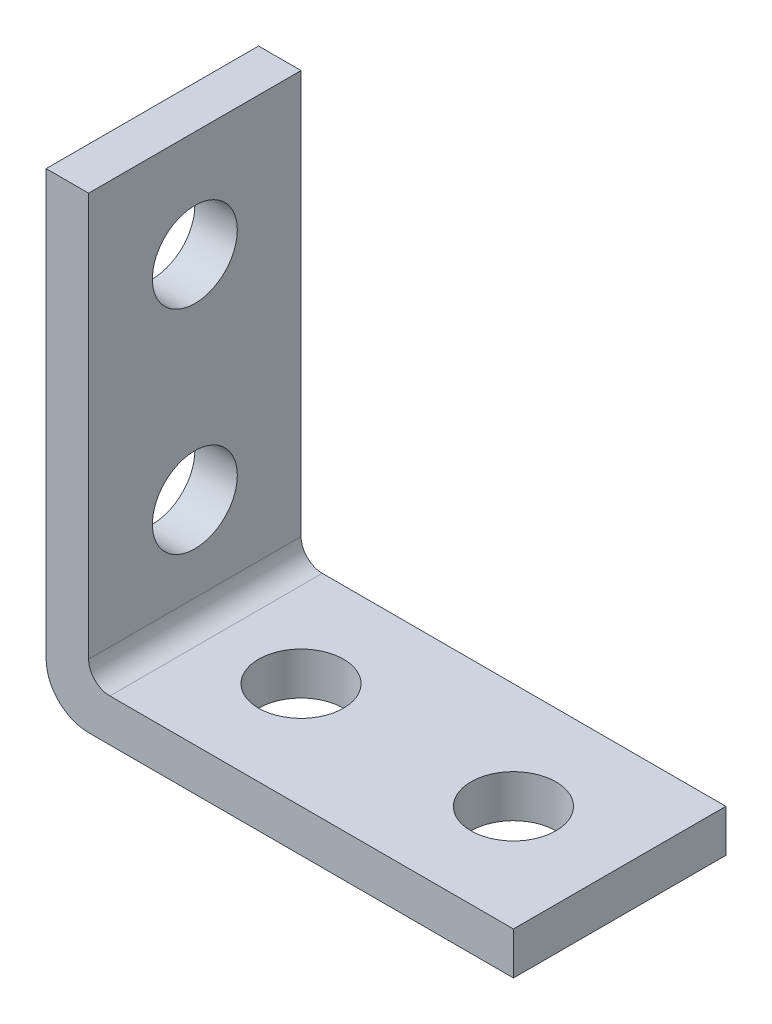
ISO-10303-21;
HEADER;
FILE_DESCRIPTION(('STEP AP214'),'2;1');
FILE_NAME('part.step','',(''),(''),'','','');
FILE_SCHEMA(('AUTOMOTIVE_DESIGN { 1 0 10303 214 1 1 1 1 }'));
ENDSEC;
DATA;
#1=APPLICATION_CONTEXT('core data for automotive mechanical design processes');
#2=APPLICATION_PROTOCOL_DEFINITION('international standard','automotive_design',2000,#1);
#3=PRODUCT_CONTEXT('',#1,'mechanical');
#4=PRODUCT('Part','Part','',(#3));
#5=PRODUCT_RELATED_PRODUCT_CATEGORY('part','',(#4));
#6=PRODUCT_DEFINITION_FORMATION('','',#4);
#7=PRODUCT_DEFINITION_CONTEXT('part definition',#1,'design');
#8=PRODUCT_DEFINITION('design','',#6,#7);
#9=PRODUCT_DEFINITION_SHAPE('','',#8);
#10=(LENGTH_UNIT() NAMED_UNIT(*) SI_UNIT(.MILLI.,.METRE.));
#11=(NAMED_UNIT(*) PLANE_ANGLE_UNIT() SI_UNIT($,.RADIAN.));
#12=(NAMED_UNIT(*) SI_UNIT($,.STERADIAN.) SOLID_ANGLE_UNIT());
#13=UNCERTAINTY_MEASURE_WITH_UNIT(LENGTH_MEASURE(1.E-05),#10,'distance_accuracy_value','');
#14=(GEOMETRIC_REPRESENTATION_CONTEXT(3) GLOBAL_UNCERTAINTY_ASSIGNED_CONTEXT((#13)) GLOBAL_UNIT_ASSIGNED_CONTEXT((#10,
#11,#12)) REPRESENTATION_CONTEXT('',''));
#15=CARTESIAN_POINT('',(0.,0.,0.));
#16=DIRECTION('',(0.,0.,1.));
#17=DIRECTION('',(1.,0.,0.));
#18=AXIS2_PLACEMENT_3D('',#15,#16,#17);
#19=CARTESIAN_POINT('',(10.,2.,5.));
#20=DIRECTION('',(0.,0.,-1.));
#21=DIRECTION('',(-1.,0.,0.));
#22=AXIS2_PLACEMENT_3D('',#19,#20,#21);
#23=PLANE('',#22);
#24=DIRECTION('',(0.,1.,0.));
#25=VECTOR('',#24,1.);
#26=CARTESIAN_POINT('',(-12.,22.,5.));
#27=LINE('',#26,#25);
#28=CARTESIAN_POINT('',(-12.,2.,5.));
#29=VERTEX_POINT('',#28);
#30=CARTESIAN_POINT('',(-12.,22.,5.));
#31=VERTEX_POINT('',#30);
#32=EDGE_CURVE('E101',#29,#31,#27,.T.);
#33=ORIENTED_EDGE('',*,*,#32,.F.);
#34=CARTESIAN_POINT('',(-10.,2.,5.));
#35=DIRECTION('',(0.,0.,-1.));
#36=DIRECTION('',(-1.,0.,0.));
#37=AXIS2_PLACEMENT_3D('',#34,#35,#36);
#38=CIRCLE('',#37,2.);
#39=CARTESIAN_POINT('',(-10.,0.,5.));
#40=VERTEX_POINT('',#39);
#41=EDGE_CURVE('E148',#29,#40,#38,.F.);
#42=ORIENTED_EDGE('',*,*,#41,.T.);
#43=DIRECTION('',(1.,0.,0.));
#44=VECTOR('',#43,1.);
#45=CARTESIAN_POINT('',(10.,0.,5.));
#46=LINE('',#45,#44);
#47=CARTESIAN_POINT('',(10.,0.,5.));
#48=VERTEX_POINT('',#47);
#49=EDGE_CURVE('E123',#40,#48,#46,.T.);
#50=ORIENTED_EDGE('',*,*,#49,.T.);
#51=DIRECTION('',(0.,-1.,0.));
#52=VECTOR('',#51,1.);
#53=CARTESIAN_POINT('',(10.,2.,5.));
#54=LINE('',#53,#52);
#55=CARTESIAN_POINT('',(10.,2.,5.));
#56=VERTEX_POINT('',#55);
#57=EDGE_CURVE('E144',#56,#48,#54,.T.);
#58=ORIENTED_EDGE('',*,*,#57,.F.);
#59=DIRECTION('',(1.,0.,0.));
#60=VECTOR('',#59,1.);
#61=CARTESIAN_POINT('',(10.,2.,5.));
#62=LINE('',#61,#60);
#63=CARTESIAN_POINT('',(-9.,2.,5.));
#64=VERTEX_POINT('',#63);
#65=EDGE_CURVE('E130',#64,#56,#62,.T.);
#66=ORIENTED_EDGE('',*,*,#65,.F.);
#67=CARTESIAN_POINT('',(-9.,3.,5.));
#68=DIRECTION('',(0.,0.,-1.));
#69=DIRECTION('',(-1.,0.,0.));
#70=AXIS2_PLACEMENT_3D('',#67,#68,#69);
#71=CIRCLE('',#70,1.);
#72=CARTESIAN_POINT('',(-10.,3.,5.));
#73=VERTEX_POINT('',#72);
#74=EDGE_CURVE('E45',#64,#73,#71,.T.);
#75=ORIENTED_EDGE('',*,*,#74,.T.);
#76=DIRECTION('',(0.,1.,0.));
#77=VECTOR('',#76,1.);
#78=CARTESIAN_POINT('',(-10.,22.,5.));
#79=LINE('',#78,#77);
#80=CARTESIAN_POINT('',(-10.,22.,5.));
#81=VERTEX_POINT('',#80);
#82=EDGE_CURVE('E121',#73,#81,#79,.T.);
#83=ORIENTED_EDGE('',*,*,#82,.T.);
#84=DIRECTION('',(1.,0.,0.));
#85=VECTOR('',#84,1.);
#86=CARTESIAN_POINT('',(-12.,22.,5.));
#87=LINE('',#86,#85);
#88=EDGE_CURVE('E115',#31,#81,#87,.T.);
#89=ORIENTED_EDGE('',*,*,#88,.F.);
#90=EDGE_LOOP('',(#33,#42,#50,#58,#66,#75,#83,#89));
#91=FACE_BOUND('',#90,.T.);
#92=ADVANCED_FACE('F37',(#91),#23,.F.);
#93=CARTESIAN_POINT('',(10.,2.,5.));
#94=DIRECTION('',(-1.,0.,0.));
#95=DIRECTION('',(0.,0.,1.));
#96=AXIS2_PLACEMENT_3D('',#93,#94,#95);
#97=PLANE('',#96);
#98=DIRECTION('',(0.,0.,-1.));
#99=VECTOR('',#98,1.);
#100=CARTESIAN_POINT('',(10.,0.,5.));
#101=LINE('',#100,#99);
#102=CARTESIAN_POINT('',(10.,0.,-5.));
#103=VERTEX_POINT('',#102);
#104=EDGE_CURVE('E125',#48,#103,#101,.T.);
#105=ORIENTED_EDGE('',*,*,#104,.T.);
#106=DIRECTION('',(0.,-1.,0.));
#107=VECTOR('',#106,1.);
#108=CARTESIAN_POINT('',(10.,2.,-5.));
#109=LINE('',#108,#107);
#110=CARTESIAN_POINT('',(10.,2.,-5.));
#111=VERTEX_POINT('',#110);
#112=EDGE_CURVE('E137',#111,#103,#109,.T.);
#113=ORIENTED_EDGE('',*,*,#112,.F.);
#114=DIRECTION('',(0.,0.,-1.));
#115=VECTOR('',#114,1.);
#116=CARTESIAN_POINT('',(10.,2.,5.));
#117=LINE('',#116,#115);
#118=EDGE_CURVE('E132',#56,#111,#117,.T.);
#119=ORIENTED_EDGE('',*,*,#118,.F.);
#120=ORIENTED_EDGE('',*,*,#57,.T.);
#121=EDGE_LOOP('',(#105,#113,#119,#120));
#122=FACE_BOUND('',#121,.T.);
#123=ADVANCED_FACE('F169',(#122),#97,.F.);
#124=CARTESIAN_POINT('',(10.,2.,-5.));
#125=DIRECTION('',(0.,0.,1.));
#126=DIRECTION('',(1.,0.,0.));
#127=AXIS2_PLACEMENT_3D('',#124,#125,#126);
#128=PLANE('',#127);
#129=DIRECTION('',(-1.,0.,0.));
#130=VECTOR('',#129,1.);
#131=CARTESIAN_POINT('',(10.,0.,-5.));
#132=LINE('',#131,#130);
#133=CARTESIAN_POINT('',(-10.,0.,-5.));
#134=VERTEX_POINT('',#133);
#135=EDGE_CURVE('E133',#103,#134,#132,.T.);
#136=ORIENTED_EDGE('',*,*,#135,.T.);
#137=CARTESIAN_POINT('',(-10.,2.,-5.));
#138=DIRECTION('',(0.,0.,1.));
#139=DIRECTION('',(1.,0.,0.));
#140=AXIS2_PLACEMENT_3D('',#137,#138,#139);
#141=CIRCLE('',#140,2.);
#142=CARTESIAN_POINT('',(-12.,2.,-5.));
#143=VERTEX_POINT('',#142);
#144=EDGE_CURVE('E152',#134,#143,#141,.F.);
#145=ORIENTED_EDGE('',*,*,#144,.T.);
#146=DIRECTION('',(0.,-1.,0.));
#147=VECTOR('',#146,1.);
#148=CARTESIAN_POINT('',(-12.,22.,-5.));
#149=LINE('',#148,#147);
#150=CARTESIAN_POINT('',(-12.,22.,-5.));
#151=VERTEX_POINT('',#150);
#152=EDGE_CURVE('E119',#151,#143,#149,.T.);
#153=ORIENTED_EDGE('',*,*,#152,.F.);
#154=DIRECTION('',(1.,0.,0.));
#155=VECTOR('',#154,1.);
#156=CARTESIAN_POINT('',(-12.,22.,-5.));
#157=LINE('',#156,#155);
#158=CARTESIAN_POINT('',(-10.,22.,-5.));
#159=VERTEX_POINT('',#158);
#160=EDGE_CURVE('E117',#151,#159,#157,.T.);
#161=ORIENTED_EDGE('',*,*,#160,.T.);
#162=DIRECTION('',(0.,-1.,0.));
#163=VECTOR('',#162,1.);
#164=CARTESIAN_POINT('',(-10.,22.,-5.));
#165=LINE('',#164,#163);
#166=CARTESIAN_POINT('',(-10.,3.,-5.));
#167=VERTEX_POINT('',#166);
#168=EDGE_CURVE('E110',#159,#167,#165,.T.);
#169=ORIENTED_EDGE('',*,*,#168,.T.);
#170=CARTESIAN_POINT('',(-9.,3.,-5.));
#171=DIRECTION('',(0.,0.,1.));
#172=DIRECTION('',(1.,0.,0.));
#173=AXIS2_PLACEMENT_3D('',#170,#171,#172);
#174=CIRCLE('',#173,1.);
#175=CARTESIAN_POINT('',(-9.,2.,-5.));
#176=VERTEX_POINT('',#175);
#177=EDGE_CURVE('E11',#167,#176,#174,.T.);
#178=ORIENTED_EDGE('',*,*,#177,.T.);
#179=DIRECTION('',(-1.,0.,0.));
#180=VECTOR('',#179,1.);
#181=CARTESIAN_POINT('',(10.,2.,-5.));
#182=LINE('',#181,#180);
#183=EDGE_CURVE('E135',#111,#176,#182,.T.);
#184=ORIENTED_EDGE('',*,*,#183,.F.);
#185=ORIENTED_EDGE('',*,*,#112,.T.);
#186=EDGE_LOOP('',(#136,#145,#153,#161,#169,#178,#184,#185));
#187=FACE_BOUND('',#186,.T.);
#188=ADVANCED_FACE('F172',(#187),#128,.F.);
#189=CARTESIAN_POINT('',(0.,2.,0.));
#190=DIRECTION('',(0.,1.,0.));
#191=DIRECTION('',(0.,0.,1.));
#192=AXIS2_PLACEMENT_3D('',#189,#190,#191);
#193=PLANE('',#192);
#194=CARTESIAN_POINT('',(-5.,2.,0.));
#195=DIRECTION('',(0.,1.,0.));
#196=DIRECTION('',(0.,0.,1.));
#197=AXIS2_PLACEMENT_3D('',#194,#195,#196);
#198=CIRCLE('',#197,2.);
#199=CARTESIAN_POINT('',(-5.,2.,2.));
#200=VERTEX_POINT('',#199);
#201=EDGE_CURVE('E241',#200,#200,#198,.T.);
#202=ORIENTED_EDGE('',*,*,#201,.F.);
#203=EDGE_LOOP('',(#202));
#204=FACE_BOUND('',#203,.T.);
#205=CARTESIAN_POINT('',(5.,2.,0.));
#206=DIRECTION('',(0.,1.,0.));
#207=DIRECTION('',(0.,0.,1.));
#208=AXIS2_PLACEMENT_3D('',#205,#206,#207);
#209=CIRCLE('',#208,2.);
#210=CARTESIAN_POINT('',(5.,2.,2.));
#211=VERTEX_POINT('',#210);
#212=EDGE_CURVE('E244',#211,#211,#209,.T.);
#213=ORIENTED_EDGE('',*,*,#212,.F.);
#214=EDGE_LOOP('',(#213));
#215=FACE_BOUND('',#214,.T.);
#216=ORIENTED_EDGE('',*,*,#183,.T.);
#217=DIRECTION('',(0.,0.,1.));
#218=VECTOR('',#217,1.);
#219=CARTESIAN_POINT('',(-9.,2.,0.));
#220=LINE('',#219,#218);
#221=EDGE_CURVE('E154',#176,#64,#220,.T.);
#222=ORIENTED_EDGE('',*,*,#221,.T.);
#223=ORIENTED_EDGE('',*,*,#65,.T.);
#224=ORIENTED_EDGE('',*,*,#118,.T.);
#225=EDGE_LOOP('',(#216,#222,#223,#224));
#226=FACE_BOUND('',#225,.T.);
#227=ADVANCED_FACE('F159',(#204,#215,#226),#193,.T.);
#228=CARTESIAN_POINT('',(0.,0.,0.));
#229=DIRECTION('',(0.,1.,0.));
#230=DIRECTION('',(0.,0.,1.));
#231=AXIS2_PLACEMENT_3D('',#228,#229,#230);
#232=PLANE('',#231);
#233=CARTESIAN_POINT('',(-5.,0.,0.));
#234=DIRECTION('',(0.,1.,0.));
#235=DIRECTION('',(0.,0.,1.));
#236=AXIS2_PLACEMENT_3D('',#233,#234,#235);
#237=CIRCLE('',#236,2.);
#238=CARTESIAN_POINT('',(-5.,0.,2.));
#239=VERTEX_POINT('',#238);
#240=EDGE_CURVE('E238',#239,#239,#237,.T.);
#241=ORIENTED_EDGE('',*,*,#240,.T.);
#242=EDGE_LOOP('',(#241));
#243=FACE_BOUND('',#242,.T.);
#244=CARTESIAN_POINT('',(5.,0.,0.));
#245=DIRECTION('',(0.,1.,0.));
#246=DIRECTION('',(0.,0.,1.));
#247=AXIS2_PLACEMENT_3D('',#244,#245,#246);
#248=CIRCLE('',#247,2.);
#249=CARTESIAN_POINT('',(5.,0.,2.));
#250=VERTEX_POINT('',#249);
#251=EDGE_CURVE('E230',#250,#250,#248,.T.);
#252=ORIENTED_EDGE('',*,*,#251,.T.);
#253=EDGE_LOOP('',(#252));
#254=FACE_BOUND('',#253,.T.);
#255=ORIENTED_EDGE('',*,*,#49,.F.);
#256=DIRECTION('',(0.,0.,1.));
#257=VECTOR('',#256,1.);
#258=CARTESIAN_POINT('',(-10.,0.,-5.));
#259=LINE('',#258,#257);
#260=EDGE_CURVE('E150',#40,#134,#259,.F.);
#261=ORIENTED_EDGE('',*,*,#260,.T.);
#262=ORIENTED_EDGE('',*,*,#135,.F.);
#263=ORIENTED_EDGE('',*,*,#104,.F.);
#264=EDGE_LOOP('',(#255,#261,#262,#263));
#265=FACE_BOUND('',#264,.T.);
#266=ADVANCED_FACE('F194',(#243,#254,#265),#232,.F.);
#267=CARTESIAN_POINT('',(-12.,22.,-5.));
#268=DIRECTION('',(0.,-1.,0.));
#269=DIRECTION('',(0.,0.,-1.));
#270=AXIS2_PLACEMENT_3D('',#267,#268,#269);
#271=PLANE('',#270);
#272=DIRECTION('',(0.,0.,-1.));
#273=VECTOR('',#272,1.);
#274=CARTESIAN_POINT('',(-10.,22.,-5.));
#275=LINE('',#274,#273);
#276=EDGE_CURVE('E251',#81,#159,#275,.T.);
#277=ORIENTED_EDGE('',*,*,#276,.T.);
#278=ORIENTED_EDGE('',*,*,#160,.F.);
#279=DIRECTION('',(0.,0.,-1.));
#280=VECTOR('',#279,1.);
#281=CARTESIAN_POINT('',(-12.,22.,-5.));
#282=LINE('',#281,#280);
#283=EDGE_CURVE('E105',#31,#151,#282,.T.);
#284=ORIENTED_EDGE('',*,*,#283,.F.);
#285=ORIENTED_EDGE('',*,*,#88,.T.);
#286=EDGE_LOOP('',(#277,#278,#284,#285));
#287=FACE_BOUND('',#286,.T.);
#288=ADVANCED_FACE('F114',(#287),#271,.F.);
#289=CARTESIAN_POINT('',(-12.,0.,0.));
#290=DIRECTION('',(-1.,0.,0.));
#291=DIRECTION('',(0.,0.,1.));
#292=AXIS2_PLACEMENT_3D('',#289,#290,#291);
#293=PLANE('',#292);
#294=CARTESIAN_POINT('',(-12.,7.,0.));
#295=DIRECTION('',(1.,0.,0.));
#296=DIRECTION('',(0.,0.,-1.));
#297=AXIS2_PLACEMENT_3D('',#294,#295,#296);
#298=CIRCLE('',#297,2.);
#299=CARTESIAN_POINT('',(-12.,7.,-2.));
#300=VERTEX_POINT('',#299);
#301=EDGE_CURVE('E224',#300,#300,#298,.T.);
#302=ORIENTED_EDGE('',*,*,#301,.T.);
#303=EDGE_LOOP('',(#302));
#304=FACE_BOUND('',#303,.T.);
#305=CARTESIAN_POINT('',(-12.,17.,0.));
#306=DIRECTION('',(1.,0.,0.));
#307=DIRECTION('',(0.,0.,-1.));
#308=AXIS2_PLACEMENT_3D('',#305,#306,#307);
#309=CIRCLE('',#308,2.);
#310=CARTESIAN_POINT('',(-12.,17.,-2.));
#311=VERTEX_POINT('',#310);
#312=EDGE_CURVE('E233',#311,#311,#309,.T.);
#313=ORIENTED_EDGE('',*,*,#312,.T.);
#314=EDGE_LOOP('',(#313));
#315=FACE_BOUND('',#314,.T.);
#316=ORIENTED_EDGE('',*,*,#152,.T.);
#317=DIRECTION('',(0.,0.,1.));
#318=VECTOR('',#317,1.);
#319=CARTESIAN_POINT('',(-12.,2.,5.));
#320=LINE('',#319,#318);
#321=EDGE_CURVE('E108',#143,#29,#320,.T.);
#322=ORIENTED_EDGE('',*,*,#321,.T.);
#323=ORIENTED_EDGE('',*,*,#32,.T.);
#324=ORIENTED_EDGE('',*,*,#283,.T.);
#325=EDGE_LOOP('',(#316,#322,#323,#324));
#326=FACE_BOUND('',#325,.T.);
#327=ADVANCED_FACE('F104',(#304,#315,#326),#293,.T.);
#328=CARTESIAN_POINT('',(-10.,0.,0.));
#329=DIRECTION('',(-1.,0.,0.));
#330=DIRECTION('',(0.,0.,1.));
#331=AXIS2_PLACEMENT_3D('',#328,#329,#330);
#332=PLANE('',#331);
#333=CARTESIAN_POINT('',(-10.,7.,0.));
#334=DIRECTION('',(1.,0.,0.));
#335=DIRECTION('',(0.,0.,-1.));
#336=AXIS2_PLACEMENT_3D('',#333,#334,#335);
#337=CIRCLE('',#336,2.);
#338=CARTESIAN_POINT('',(-10.,7.,-2.));
#339=VERTEX_POINT('',#338);
#340=EDGE_CURVE('E227',#339,#339,#337,.T.);
#341=ORIENTED_EDGE('',*,*,#340,.F.);
#342=EDGE_LOOP('',(#341));
#343=FACE_BOUND('',#342,.T.);
#344=CARTESIAN_POINT('',(-10.,17.,0.));
#345=DIRECTION('',(1.,0.,0.));
#346=DIRECTION('',(0.,0.,-1.));
#347=AXIS2_PLACEMENT_3D('',#344,#345,#346);
#348=CIRCLE('',#347,2.);
#349=CARTESIAN_POINT('',(-10.,17.,-2.));
#350=VERTEX_POINT('',#349);
#351=EDGE_CURVE('E228',#350,#350,#348,.T.);
#352=ORIENTED_EDGE('',*,*,#351,.F.);
#353=EDGE_LOOP('',(#352));
#354=FACE_BOUND('',#353,.T.);
#355=ORIENTED_EDGE('',*,*,#82,.F.);
#356=DIRECTION('',(0.,0.,1.));
#357=VECTOR('',#356,1.);
#358=CARTESIAN_POINT('',(-10.,3.,0.));
#359=LINE('',#358,#357);
#360=EDGE_CURVE('E58',#73,#167,#359,.F.);
#361=ORIENTED_EDGE('',*,*,#360,.T.);
#362=ORIENTED_EDGE('',*,*,#168,.F.);
#363=ORIENTED_EDGE('',*,*,#276,.F.);
#364=EDGE_LOOP('',(#355,#361,#362,#363));
#365=FACE_BOUND('',#364,.T.);
#366=ADVANCED_FACE('F183',(#343,#354,#365),#332,.F.);
#367=CARTESIAN_POINT('',(-10.,2.,0.));
#368=DIRECTION('',(0.,0.,-1.));
#369=DIRECTION('',(-1.,0.,0.));
#370=AXIS2_PLACEMENT_3D('',#367,#368,#369);
#371=CYLINDRICAL_SURFACE('',#370,2.);
#372=ORIENTED_EDGE('',*,*,#144,.F.);
#373=ORIENTED_EDGE('',*,*,#260,.F.);
#374=ORIENTED_EDGE('',*,*,#41,.F.);
#375=ORIENTED_EDGE('',*,*,#321,.F.);
#376=EDGE_LOOP('',(#372,#373,#374,#375));
#377=FACE_BOUND('',#376,.T.);
#378=ADVANCED_FACE('F175',(#377),#371,.T.);
#379=CARTESIAN_POINT('',(-9.,3.,0.));
#380=DIRECTION('',(0.,0.,1.));
#381=DIRECTION('',(1.,0.,0.));
#382=AXIS2_PLACEMENT_3D('',#379,#380,#381);
#383=CYLINDRICAL_SURFACE('',#382,1.);
#384=ORIENTED_EDGE('',*,*,#177,.F.);
#385=ORIENTED_EDGE('',*,*,#360,.F.);
#386=ORIENTED_EDGE('',*,*,#74,.F.);
#387=ORIENTED_EDGE('',*,*,#221,.F.);
#388=EDGE_LOOP('',(#384,#385,#386,#387));
#389=FACE_BOUND('',#388,.T.);
#390=ADVANCED_FACE('F39',(#389),#383,.F.);
#391=CARTESIAN_POINT('',(5.,0.,0.));
#392=DIRECTION('',(0.,1.,0.));
#393=DIRECTION('',(0.,0.,1.));
#394=AXIS2_PLACEMENT_3D('',#391,#392,#393);
#395=CYLINDRICAL_SURFACE('',#394,2.);
#396=ORIENTED_EDGE('',*,*,#251,.F.);
#397=EDGE_LOOP('',(#396));
#398=FACE_BOUND('',#397,.T.);
#399=ORIENTED_EDGE('',*,*,#212,.T.);
#400=EDGE_LOOP('',(#399));
#401=FACE_BOUND('',#400,.T.);
#402=ADVANCED_FACE('F174',(#398,#401),#395,.F.);
#403=CARTESIAN_POINT('',(-5.,0.,0.));
#404=DIRECTION('',(0.,1.,0.));
#405=DIRECTION('',(0.,0.,1.));
#406=AXIS2_PLACEMENT_3D('',#403,#404,#405);
#407=CYLINDRICAL_SURFACE('',#406,2.);
#408=ORIENTED_EDGE('',*,*,#240,.F.);
#409=EDGE_LOOP('',(#408));
#410=FACE_BOUND('',#409,.T.);
#411=ORIENTED_EDGE('',*,*,#201,.T.);
#412=EDGE_LOOP('',(#411));
#413=FACE_BOUND('',#412,.T.);
#414=ADVANCED_FACE('F180',(#410,#413),#407,.F.);
#415=CARTESIAN_POINT('',(-12.,17.,0.));
#416=DIRECTION('',(1.,0.,0.));
#417=DIRECTION('',(0.,0.,-1.));
#418=AXIS2_PLACEMENT_3D('',#415,#416,#417);
#419=CYLINDRICAL_SURFACE('',#418,2.);
#420=ORIENTED_EDGE('',*,*,#312,.F.);
#421=EDGE_LOOP('',(#420));
#422=FACE_BOUND('',#421,.T.);
#423=ORIENTED_EDGE('',*,*,#351,.T.);
#424=EDGE_LOOP('',(#423));
#425=FACE_BOUND('',#424,.T.);
#426=ADVANCED_FACE('F211',(#422,#425),#419,.F.);
#427=CARTESIAN_POINT('',(-12.,7.,0.));
#428=DIRECTION('',(1.,0.,0.));
#429=DIRECTION('',(0.,0.,-1.));
#430=AXIS2_PLACEMENT_3D('',#427,#428,#429);
#431=CYLINDRICAL_SURFACE('',#430,2.);
#432=ORIENTED_EDGE('',*,*,#301,.F.);
#433=EDGE_LOOP('',(#432));
#434=FACE_BOUND('',#433,.T.);
#435=ORIENTED_EDGE('',*,*,#340,.T.);
#436=EDGE_LOOP('',(#435));
#437=FACE_BOUND('',#436,.T.);
#438=ADVANCED_FACE('F215',(#434,#437),#431,.F.);
#439=CLOSED_SHELL('',(#92,#123,#188,#227,#266,#288,#327,#366,#378,#390,#402,#414,#426,#438));
#440=MANIFOLD_SOLID_BREP('B2',#439);
#441=ADVANCED_BREP_SHAPE_REPRESENTATION('',(#18,#440),#14);
#442=SHAPE_DEFINITION_REPRESENTATION(#9,#441);
ENDSEC;
END-ISO-10303-21;
